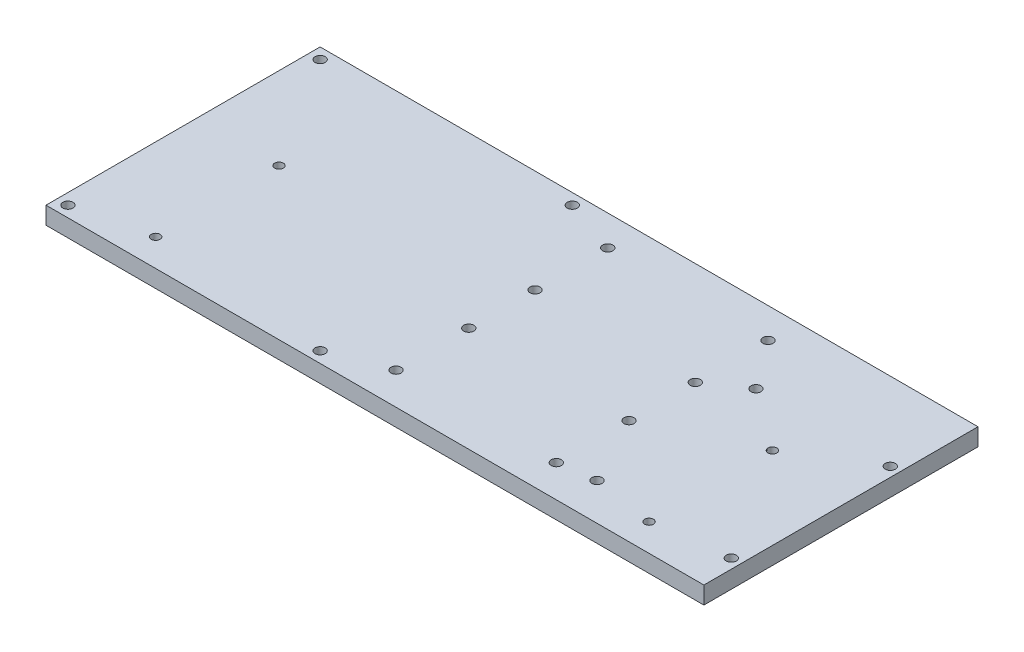
ISO-10303-21;
HEADER;
FILE_DESCRIPTION(('STEP AP214'),'2;1');
FILE_NAME('part.step','',(''),(''),'','','');
FILE_SCHEMA(('AUTOMOTIVE_DESIGN { 1 0 10303 214 1 1 1 1 }'));
ENDSEC;
DATA;
#1=APPLICATION_CONTEXT('core data for automotive mechanical design processes');
#2=APPLICATION_PROTOCOL_DEFINITION('international standard','automotive_design',2000,#1);
#3=PRODUCT_CONTEXT('',#1,'mechanical');
#4=PRODUCT('Part','Part','',(#3));
#5=PRODUCT_RELATED_PRODUCT_CATEGORY('part','',(#4));
#6=PRODUCT_DEFINITION_FORMATION('','',#4);
#7=PRODUCT_DEFINITION_CONTEXT('part definition',#1,'design');
#8=PRODUCT_DEFINITION('design','',#6,#7);
#9=PRODUCT_DEFINITION_SHAPE('','',#8);
#10=(LENGTH_UNIT() NAMED_UNIT(*) SI_UNIT(.MILLI.,.METRE.));
#11=(NAMED_UNIT(*) PLANE_ANGLE_UNIT() SI_UNIT($,.RADIAN.));
#12=(NAMED_UNIT(*) SI_UNIT($,.STERADIAN.) SOLID_ANGLE_UNIT());
#13=UNCERTAINTY_MEASURE_WITH_UNIT(LENGTH_MEASURE(1.E-05),#10,'distance_accuracy_value','');
#14=(GEOMETRIC_REPRESENTATION_CONTEXT(3) GLOBAL_UNCERTAINTY_ASSIGNED_CONTEXT((#13)) GLOBAL_UNIT_ASSIGNED_CONTEXT((#10,
#11,#12)) REPRESENTATION_CONTEXT('',''));
#15=CARTESIAN_POINT('',(0.,0.,0.));
#16=DIRECTION('',(0.,0.,1.));
#17=DIRECTION('',(1.,0.,0.));
#18=AXIS2_PLACEMENT_3D('',#15,#16,#17);
#19=CARTESIAN_POINT('',(120.,6.35,50.));
#20=DIRECTION('',(-1.,0.,0.));
#21=DIRECTION('',(0.,0.,1.));
#22=AXIS2_PLACEMENT_3D('',#19,#20,#21);
#23=PLANE('',#22);
#24=DIRECTION('',(0.,0.,-1.));
#25=VECTOR('',#24,1.);
#26=CARTESIAN_POINT('',(120.,0.,50.));
#27=LINE('',#26,#25);
#28=CARTESIAN_POINT('',(120.,0.,50.));
#29=VERTEX_POINT('',#28);
#30=CARTESIAN_POINT('',(120.,0.,-50.));
#31=VERTEX_POINT('',#30);
#32=EDGE_CURVE('E96',#29,#31,#27,.T.);
#33=ORIENTED_EDGE('',*,*,#32,.T.);
#34=DIRECTION('',(0.,-1.,0.));
#35=VECTOR('',#34,1.);
#36=CARTESIAN_POINT('',(120.,6.35,-50.));
#37=LINE('',#36,#35);
#38=CARTESIAN_POINT('',(120.,6.35,-50.));
#39=VERTEX_POINT('',#38);
#40=EDGE_CURVE('E11',#39,#31,#37,.T.);
#41=ORIENTED_EDGE('',*,*,#40,.F.);
#42=DIRECTION('',(0.,0.,-1.));
#43=VECTOR('',#42,1.);
#44=CARTESIAN_POINT('',(120.,6.35,50.));
#45=LINE('',#44,#43);
#46=CARTESIAN_POINT('',(120.,6.35,50.));
#47=VERTEX_POINT('',#46);
#48=EDGE_CURVE('E84',#47,#39,#45,.T.);
#49=ORIENTED_EDGE('',*,*,#48,.F.);
#50=DIRECTION('',(0.,-1.,0.));
#51=VECTOR('',#50,1.);
#52=CARTESIAN_POINT('',(120.,6.35,50.));
#53=LINE('',#52,#51);
#54=EDGE_CURVE('E92',#47,#29,#53,.T.);
#55=ORIENTED_EDGE('',*,*,#54,.T.);
#56=EDGE_LOOP('',(#33,#41,#49,#55));
#57=FACE_BOUND('',#56,.T.);
#58=ADVANCED_FACE('F33',(#57),#23,.F.);
#59=CARTESIAN_POINT('',(-120.,6.35,-50.));
#60=DIRECTION('',(0.,0.,1.));
#61=DIRECTION('',(1.,0.,0.));
#62=AXIS2_PLACEMENT_3D('',#59,#60,#61);
#63=PLANE('',#62);
#64=DIRECTION('',(-1.,0.,0.));
#65=VECTOR('',#64,1.);
#66=CARTESIAN_POINT('',(-120.,0.,-50.));
#67=LINE('',#66,#65);
#68=CARTESIAN_POINT('',(-120.,0.,-50.));
#69=VERTEX_POINT('',#68);
#70=EDGE_CURVE('E88',#31,#69,#67,.T.);
#71=ORIENTED_EDGE('',*,*,#70,.T.);
#72=DIRECTION('',(0.,-1.,0.));
#73=VECTOR('',#72,1.);
#74=CARTESIAN_POINT('',(-120.,6.35,-50.));
#75=LINE('',#74,#73);
#76=CARTESIAN_POINT('',(-120.,6.35,-50.));
#77=VERTEX_POINT('',#76);
#78=EDGE_CURVE('E41',#77,#69,#75,.T.);
#79=ORIENTED_EDGE('',*,*,#78,.F.);
#80=DIRECTION('',(-1.,0.,0.));
#81=VECTOR('',#80,1.);
#82=CARTESIAN_POINT('',(-120.,6.35,-50.));
#83=LINE('',#82,#81);
#84=EDGE_CURVE('E79',#39,#77,#83,.T.);
#85=ORIENTED_EDGE('',*,*,#84,.F.);
#86=ORIENTED_EDGE('',*,*,#40,.T.);
#87=EDGE_LOOP('',(#71,#79,#85,#86));
#88=FACE_BOUND('',#87,.T.);
#89=ADVANCED_FACE('F87',(#88),#63,.F.);
#90=CARTESIAN_POINT('',(-120.,6.35,50.));
#91=DIRECTION('',(1.,0.,0.));
#92=DIRECTION('',(0.,0.,-1.));
#93=AXIS2_PLACEMENT_3D('',#90,#91,#92);
#94=PLANE('',#93);
#95=DIRECTION('',(0.,0.,1.));
#96=VECTOR('',#95,1.);
#97=CARTESIAN_POINT('',(-120.,0.,50.));
#98=LINE('',#97,#96);
#99=CARTESIAN_POINT('',(-120.,0.,50.));
#100=VERTEX_POINT('',#99);
#101=EDGE_CURVE('E66',#69,#100,#98,.T.);
#102=ORIENTED_EDGE('',*,*,#101,.T.);
#103=DIRECTION('',(0.,-1.,0.));
#104=VECTOR('',#103,1.);
#105=CARTESIAN_POINT('',(-120.,6.35,50.));
#106=LINE('',#105,#104);
#107=CARTESIAN_POINT('',(-120.,6.35,50.));
#108=VERTEX_POINT('',#107);
#109=EDGE_CURVE('E89',#108,#100,#106,.T.);
#110=ORIENTED_EDGE('',*,*,#109,.F.);
#111=DIRECTION('',(0.,0.,1.));
#112=VECTOR('',#111,1.);
#113=CARTESIAN_POINT('',(-120.,6.35,50.));
#114=LINE('',#113,#112);
#115=EDGE_CURVE('E82',#77,#108,#114,.T.);
#116=ORIENTED_EDGE('',*,*,#115,.F.);
#117=ORIENTED_EDGE('',*,*,#78,.T.);
#118=EDGE_LOOP('',(#102,#110,#116,#117));
#119=FACE_BOUND('',#118,.T.);
#120=ADVANCED_FACE('F90',(#119),#94,.F.);
#121=CARTESIAN_POINT('',(-120.,6.35,50.));
#122=DIRECTION('',(0.,0.,-1.));
#123=DIRECTION('',(-1.,0.,0.));
#124=AXIS2_PLACEMENT_3D('',#121,#122,#123);
#125=PLANE('',#124);
#126=DIRECTION('',(1.,0.,0.));
#127=VECTOR('',#126,1.);
#128=CARTESIAN_POINT('',(-120.,0.,50.));
#129=LINE('',#128,#127);
#130=EDGE_CURVE('E72',#100,#29,#129,.T.);
#131=ORIENTED_EDGE('',*,*,#130,.T.);
#132=ORIENTED_EDGE('',*,*,#54,.F.);
#133=DIRECTION('',(1.,0.,0.));
#134=VECTOR('',#133,1.);
#135=CARTESIAN_POINT('',(-120.,6.35,50.));
#136=LINE('',#135,#134);
#137=EDGE_CURVE('E49',#108,#47,#136,.T.);
#138=ORIENTED_EDGE('',*,*,#137,.F.);
#139=ORIENTED_EDGE('',*,*,#109,.T.);
#140=EDGE_LOOP('',(#131,#132,#138,#139));
#141=FACE_BOUND('',#140,.T.);
#142=ADVANCED_FACE('F104',(#141),#125,.F.);
#143=CARTESIAN_POINT('',(0.,6.35,0.));
#144=DIRECTION('',(0.,-1.,0.));
#145=DIRECTION('',(0.,0.,-1.));
#146=AXIS2_PLACEMENT_3D('',#143,#144,#145);
#147=PLANE('',#146);
#148=CARTESIAN_POINT('',(-90.,6.35,40.));
#149=DIRECTION('',(0.,1.,0.));
#150=DIRECTION('',(0.,0.,1.));
#151=AXIS2_PLACEMENT_3D('',#148,#149,#150);
#152=CIRCLE('',#151,1.60000000000001);
#153=CARTESIAN_POINT('',(-90.,6.35,41.6));
#154=VERTEX_POINT('',#153);
#155=EDGE_CURVE('E224',#154,#154,#152,.T.);
#156=ORIENTED_EDGE('',*,*,#155,.F.);
#157=EDGE_LOOP('',(#156));
#158=FACE_BOUND('',#157,.T.);
#159=CARTESIAN_POINT('',(90.,6.35,-5.));
#160=DIRECTION('',(0.,1.,0.));
#161=DIRECTION('',(0.,0.,1.));
#162=AXIS2_PLACEMENT_3D('',#159,#160,#161);
#163=CIRCLE('',#162,1.60000000000001);
#164=CARTESIAN_POINT('',(90.,6.35,-3.39999999999999));
#165=VERTEX_POINT('',#164);
#166=EDGE_CURVE('E218',#165,#165,#163,.T.);
#167=ORIENTED_EDGE('',*,*,#166,.F.);
#168=EDGE_LOOP('',(#167));
#169=FACE_BOUND('',#168,.T.);
#170=CARTESIAN_POINT('',(90.,6.35,40.));
#171=DIRECTION('',(0.,1.,0.));
#172=DIRECTION('',(0.,0.,1.));
#173=AXIS2_PLACEMENT_3D('',#170,#171,#172);
#174=CIRCLE('',#173,1.60000000000001);
#175=CARTESIAN_POINT('',(90.,6.35,41.6));
#176=VERTEX_POINT('',#175);
#177=EDGE_CURVE('E212',#176,#176,#174,.T.);
#178=ORIENTED_EDGE('',*,*,#177,.F.);
#179=EDGE_LOOP('',(#178));
#180=FACE_BOUND('',#179,.T.);
#181=CARTESIAN_POINT('',(-90.,6.35,-5.));
#182=DIRECTION('',(0.,1.,0.));
#183=DIRECTION('',(0.,0.,1.));
#184=AXIS2_PLACEMENT_3D('',#181,#182,#183);
#185=CIRCLE('',#184,1.60000000000001);
#186=CARTESIAN_POINT('',(-90.,6.35,-3.39999999999999));
#187=VERTEX_POINT('',#186);
#188=EDGE_CURVE('E206',#187,#187,#185,.T.);
#189=ORIENTED_EDGE('',*,*,#188,.F.);
#190=EDGE_LOOP('',(#189));
#191=FACE_BOUND('',#190,.T.);
#192=CARTESIAN_POINT('',(-4.025,6.35,-12.4399999999999));
#193=DIRECTION('',(0.,-1.,0.));
#194=DIRECTION('',(0.,0.,-1.));
#195=AXIS2_PLACEMENT_3D('',#192,#193,#194);
#196=CIRCLE('',#195,1.85);
#197=CARTESIAN_POINT('',(-4.025,6.35,-14.2899999999999));
#198=VERTEX_POINT('',#197);
#199=EDGE_CURVE('E199',#198,#198,#196,.T.);
#200=ORIENTED_EDGE('',*,*,#199,.T.);
#201=EDGE_LOOP('',(#200));
#202=FACE_BOUND('',#201,.T.);
#203=CARTESIAN_POINT('',(-24.,6.35,-45.9999999999999));
#204=DIRECTION('',(0.,-1.,0.));
#205=DIRECTION('',(0.,0.,-1.));
#206=AXIS2_PLACEMENT_3D('',#203,#204,#205);
#207=CIRCLE('',#206,1.85);
#208=CARTESIAN_POINT('',(-24.,6.35,-47.8499999999999));
#209=VERTEX_POINT('',#208);
#210=EDGE_CURVE('E193',#209,#209,#207,.T.);
#211=ORIENTED_EDGE('',*,*,#210,.T.);
#212=EDGE_LOOP('',(#211));
#213=FACE_BOUND('',#212,.T.);
#214=CARTESIAN_POINT('',(-4.02499999999999,6.35,-38.9599999999999));
#215=DIRECTION('',(0.,-1.,0.));
#216=DIRECTION('',(0.,0.,-1.));
#217=AXIS2_PLACEMENT_3D('',#214,#215,#216);
#218=CIRCLE('',#217,1.85);
#219=CARTESIAN_POINT('',(-4.02499999999999,6.35,-40.8099999999999));
#220=VERTEX_POINT('',#219);
#221=EDGE_CURVE('E187',#220,#220,#218,.T.);
#222=ORIENTED_EDGE('',*,*,#221,.T.);
#223=EDGE_LOOP('',(#222));
#224=FACE_BOUND('',#223,.T.);
#225=CARTESIAN_POINT('',(-4.02500000000004,6.35,11.7400000000001));
#226=DIRECTION('',(0.,-1.,0.));
#227=DIRECTION('',(0.,0.,-1.));
#228=AXIS2_PLACEMENT_3D('',#225,#226,#227);
#229=CIRCLE('',#228,1.85);
#230=CARTESIAN_POINT('',(-4.02500000000004,6.35,9.89000000000007));
#231=VERTEX_POINT('',#230);
#232=EDGE_CURVE('E181',#231,#231,#229,.T.);
#233=ORIENTED_EDGE('',*,*,#232,.T.);
#234=EDGE_LOOP('',(#233));
#235=FACE_BOUND('',#234,.T.);
#236=CARTESIAN_POINT('',(-4.02500000000004,6.35,38.2600000000001));
#237=DIRECTION('',(0.,-1.,0.));
#238=DIRECTION('',(0.,0.,-1.));
#239=AXIS2_PLACEMENT_3D('',#236,#237,#238);
#240=CIRCLE('',#239,1.85);
#241=CARTESIAN_POINT('',(-4.02500000000004,6.35,36.4100000000001));
#242=VERTEX_POINT('',#241);
#243=EDGE_CURVE('E175',#242,#242,#240,.T.);
#244=ORIENTED_EDGE('',*,*,#243,.T.);
#245=EDGE_LOOP('',(#244));
#246=FACE_BOUND('',#245,.T.);
#247=CARTESIAN_POINT('',(-24.0000000000001,6.35,46.0000000000001));
#248=DIRECTION('',(0.,-1.,0.));
#249=DIRECTION('',(0.,0.,-1.));
#250=AXIS2_PLACEMENT_3D('',#247,#248,#249);
#251=CIRCLE('',#250,1.85);
#252=CARTESIAN_POINT('',(-24.0000000000001,6.35,44.1500000000001));
#253=VERTEX_POINT('',#252);
#254=EDGE_CURVE('E169',#253,#253,#251,.T.);
#255=ORIENTED_EDGE('',*,*,#254,.T.);
#256=EDGE_LOOP('',(#255));
#257=FACE_BOUND('',#256,.T.);
#258=CARTESIAN_POINT('',(-116.,6.35,46.));
#259=DIRECTION('',(0.,-1.,0.));
#260=DIRECTION('',(0.,0.,-1.));
#261=AXIS2_PLACEMENT_3D('',#258,#259,#260);
#262=CIRCLE('',#261,1.85);
#263=CARTESIAN_POINT('',(-116.,6.35,44.15));
#264=VERTEX_POINT('',#263);
#265=EDGE_CURVE('E163',#264,#264,#262,.T.);
#266=ORIENTED_EDGE('',*,*,#265,.T.);
#267=EDGE_LOOP('',(#266));
#268=FACE_BOUND('',#267,.T.);
#269=CARTESIAN_POINT('',(54.425,6.35,38.2600000000001));
#270=DIRECTION('',(0.,-1.,0.));
#271=DIRECTION('',(0.,0.,-1.));
#272=AXIS2_PLACEMENT_3D('',#269,#270,#271);
#273=CIRCLE('',#272,1.85);
#274=CARTESIAN_POINT('',(54.425,6.35,36.4100000000001));
#275=VERTEX_POINT('',#274);
#276=EDGE_CURVE('E157',#275,#275,#273,.T.);
#277=ORIENTED_EDGE('',*,*,#276,.T.);
#278=EDGE_LOOP('',(#277));
#279=FACE_BOUND('',#278,.T.);
#280=CARTESIAN_POINT('',(54.425,6.35,11.7400000000001));
#281=DIRECTION('',(0.,-1.,0.));
#282=DIRECTION('',(0.,0.,-1.));
#283=AXIS2_PLACEMENT_3D('',#280,#281,#282);
#284=CIRCLE('',#283,1.85);
#285=CARTESIAN_POINT('',(54.425,6.35,9.89000000000009));
#286=VERTEX_POINT('',#285);
#287=EDGE_CURVE('E151',#286,#286,#284,.T.);
#288=ORIENTED_EDGE('',*,*,#287,.T.);
#289=EDGE_LOOP('',(#288));
#290=FACE_BOUND('',#289,.T.);
#291=CARTESIAN_POINT('',(54.425,6.35,-12.4399999999999));
#292=DIRECTION('',(0.,-1.,0.));
#293=DIRECTION('',(0.,0.,-1.));
#294=AXIS2_PLACEMENT_3D('',#291,#292,#293);
#295=CIRCLE('',#294,1.85);
#296=CARTESIAN_POINT('',(54.425,6.35,-14.2899999999999));
#297=VERTEX_POINT('',#296);
#298=EDGE_CURVE('E145',#297,#297,#295,.T.);
#299=ORIENTED_EDGE('',*,*,#298,.T.);
#300=EDGE_LOOP('',(#299));
#301=FACE_BOUND('',#300,.T.);
#302=CARTESIAN_POINT('',(54.425,6.35,-38.9599999999999));
#303=DIRECTION('',(0.,-1.,0.));
#304=DIRECTION('',(0.,0.,-1.));
#305=AXIS2_PLACEMENT_3D('',#302,#303,#304);
#306=CIRCLE('',#305,1.85);
#307=CARTESIAN_POINT('',(54.425,6.35,-40.8099999999999));
#308=VERTEX_POINT('',#307);
#309=EDGE_CURVE('E139',#308,#308,#306,.T.);
#310=ORIENTED_EDGE('',*,*,#309,.T.);
#311=EDGE_LOOP('',(#310));
#312=FACE_BOUND('',#311,.T.);
#313=CARTESIAN_POINT('',(116.5,6.35,36.5));
#314=DIRECTION('',(0.,-1.,0.));
#315=DIRECTION('',(0.,0.,-1.));
#316=AXIS2_PLACEMENT_3D('',#313,#314,#315);
#317=CIRCLE('',#316,1.85);
#318=CARTESIAN_POINT('',(116.5,6.35,34.65));
#319=VERTEX_POINT('',#318);
#320=EDGE_CURVE('E133',#319,#319,#317,.T.);
#321=ORIENTED_EDGE('',*,*,#320,.T.);
#322=EDGE_LOOP('',(#321));
#323=FACE_BOUND('',#322,.T.);
#324=CARTESIAN_POINT('',(116.5,6.35,-21.5));
#325=DIRECTION('',(0.,-1.,0.));
#326=DIRECTION('',(0.,0.,-1.));
#327=AXIS2_PLACEMENT_3D('',#324,#325,#326);
#328=CIRCLE('',#327,1.85);
#329=CARTESIAN_POINT('',(116.5,6.35,-23.35));
#330=VERTEX_POINT('',#329);
#331=EDGE_CURVE('E127',#330,#330,#328,.T.);
#332=ORIENTED_EDGE('',*,*,#331,.T.);
#333=EDGE_LOOP('',(#332));
#334=FACE_BOUND('',#333,.T.);
#335=CARTESIAN_POINT('',(67.5,6.35,-21.5));
#336=DIRECTION('',(0.,-1.,0.));
#337=DIRECTION('',(0.,0.,-1.));
#338=AXIS2_PLACEMENT_3D('',#335,#336,#337);
#339=CIRCLE('',#338,1.85);
#340=CARTESIAN_POINT('',(67.5,6.35,-23.35));
#341=VERTEX_POINT('',#340);
#342=EDGE_CURVE('E121',#341,#341,#339,.T.);
#343=ORIENTED_EDGE('',*,*,#342,.T.);
#344=EDGE_LOOP('',(#343));
#345=FACE_BOUND('',#344,.T.);
#346=CARTESIAN_POINT('',(67.5,6.35,36.5));
#347=DIRECTION('',(0.,-1.,0.));
#348=DIRECTION('',(0.,0.,-1.));
#349=AXIS2_PLACEMENT_3D('',#346,#347,#348);
#350=CIRCLE('',#349,1.85);
#351=CARTESIAN_POINT('',(67.5,6.35,34.65));
#352=VERTEX_POINT('',#351);
#353=EDGE_CURVE('E115',#352,#352,#350,.T.);
#354=ORIENTED_EDGE('',*,*,#353,.T.);
#355=EDGE_LOOP('',(#354));
#356=FACE_BOUND('',#355,.T.);
#357=CARTESIAN_POINT('',(-116.,6.35,-46.));
#358=DIRECTION('',(0.,-1.,0.));
#359=DIRECTION('',(0.,0.,-1.));
#360=AXIS2_PLACEMENT_3D('',#357,#358,#359);
#361=CIRCLE('',#360,1.85);
#362=CARTESIAN_POINT('',(-116.,6.35,-47.85));
#363=VERTEX_POINT('',#362);
#364=EDGE_CURVE('E99',#363,#363,#361,.T.);
#365=ORIENTED_EDGE('',*,*,#364,.T.);
#366=EDGE_LOOP('',(#365));
#367=FACE_BOUND('',#366,.T.);
#368=ORIENTED_EDGE('',*,*,#48,.T.);
#369=ORIENTED_EDGE('',*,*,#84,.T.);
#370=ORIENTED_EDGE('',*,*,#115,.T.);
#371=ORIENTED_EDGE('',*,*,#137,.T.);
#372=EDGE_LOOP('',(#368,#369,#370,#371));
#373=FACE_BOUND('',#372,.T.);
#374=ADVANCED_FACE('F80',(#158,#169,#180,#191,#202,#213,#224,#235,#246,#257,#268,#279,#290,#301,
#312,#323,#334,#345,#356,#367,#373),#147,.F.);
#375=CARTESIAN_POINT('',(0.,0.,0.));
#376=DIRECTION('',(0.,-1.,0.));
#377=DIRECTION('',(0.,0.,-1.));
#378=AXIS2_PLACEMENT_3D('',#375,#376,#377);
#379=PLANE('',#378);
#380=CARTESIAN_POINT('',(-90.,0.,40.));
#381=DIRECTION('',(0.,1.,0.));
#382=DIRECTION('',(0.,0.,1.));
#383=AXIS2_PLACEMENT_3D('',#380,#381,#382);
#384=CIRCLE('',#383,1.60000000000001);
#385=CARTESIAN_POINT('',(-90.,0.,41.6));
#386=VERTEX_POINT('',#385);
#387=EDGE_CURVE('E209',#386,#386,#384,.T.);
#388=ORIENTED_EDGE('',*,*,#387,.T.);
#389=EDGE_LOOP('',(#388));
#390=FACE_BOUND('',#389,.T.);
#391=CARTESIAN_POINT('',(90.,0.,-5.));
#392=DIRECTION('',(0.,1.,0.));
#393=DIRECTION('',(0.,0.,1.));
#394=AXIS2_PLACEMENT_3D('',#391,#392,#393);
#395=CIRCLE('',#394,1.60000000000001);
#396=CARTESIAN_POINT('',(90.,0.,-3.39999999999999));
#397=VERTEX_POINT('',#396);
#398=EDGE_CURVE('E221',#397,#397,#395,.T.);
#399=ORIENTED_EDGE('',*,*,#398,.T.);
#400=EDGE_LOOP('',(#399));
#401=FACE_BOUND('',#400,.T.);
#402=CARTESIAN_POINT('',(90.,0.,40.));
#403=DIRECTION('',(0.,1.,0.));
#404=DIRECTION('',(0.,0.,1.));
#405=AXIS2_PLACEMENT_3D('',#402,#403,#404);
#406=CIRCLE('',#405,1.60000000000001);
#407=CARTESIAN_POINT('',(90.,0.,41.6));
#408=VERTEX_POINT('',#407);
#409=EDGE_CURVE('E215',#408,#408,#406,.T.);
#410=ORIENTED_EDGE('',*,*,#409,.T.);
#411=EDGE_LOOP('',(#410));
#412=FACE_BOUND('',#411,.T.);
#413=CARTESIAN_POINT('',(-90.,0.,-5.));
#414=DIRECTION('',(0.,1.,0.));
#415=DIRECTION('',(0.,0.,1.));
#416=AXIS2_PLACEMENT_3D('',#413,#414,#415);
#417=CIRCLE('',#416,1.60000000000001);
#418=CARTESIAN_POINT('',(-90.,0.,-3.39999999999999));
#419=VERTEX_POINT('',#418);
#420=EDGE_CURVE('E205',#419,#419,#417,.T.);
#421=ORIENTED_EDGE('',*,*,#420,.T.);
#422=EDGE_LOOP('',(#421));
#423=FACE_BOUND('',#422,.T.);
#424=CARTESIAN_POINT('',(-4.025,0.,-12.4399999999999));
#425=DIRECTION('',(0.,-1.,0.));
#426=DIRECTION('',(0.,0.,-1.));
#427=AXIS2_PLACEMENT_3D('',#424,#425,#426);
#428=CIRCLE('',#427,1.84999999999999);
#429=CARTESIAN_POINT('',(-4.025,0.,-14.2899999999999));
#430=VERTEX_POINT('',#429);
#431=EDGE_CURVE('E202',#430,#430,#428,.T.);
#432=ORIENTED_EDGE('',*,*,#431,.F.);
#433=EDGE_LOOP('',(#432));
#434=FACE_BOUND('',#433,.T.);
#435=CARTESIAN_POINT('',(-24.,0.,-45.9999999999999));
#436=DIRECTION('',(0.,-1.,0.));
#437=DIRECTION('',(0.,0.,-1.));
#438=AXIS2_PLACEMENT_3D('',#435,#436,#437);
#439=CIRCLE('',#438,1.84999999999999);
#440=CARTESIAN_POINT('',(-24.,0.,-47.8499999999999));
#441=VERTEX_POINT('',#440);
#442=EDGE_CURVE('E196',#441,#441,#439,.T.);
#443=ORIENTED_EDGE('',*,*,#442,.F.);
#444=EDGE_LOOP('',(#443));
#445=FACE_BOUND('',#444,.T.);
#446=CARTESIAN_POINT('',(-4.02499999999999,0.,-38.9599999999999));
#447=DIRECTION('',(0.,-1.,0.));
#448=DIRECTION('',(0.,0.,-1.));
#449=AXIS2_PLACEMENT_3D('',#446,#447,#448);
#450=CIRCLE('',#449,1.84999999999999);
#451=CARTESIAN_POINT('',(-4.02499999999999,0.,-40.8099999999999));
#452=VERTEX_POINT('',#451);
#453=EDGE_CURVE('E190',#452,#452,#450,.T.);
#454=ORIENTED_EDGE('',*,*,#453,.F.);
#455=EDGE_LOOP('',(#454));
#456=FACE_BOUND('',#455,.T.);
#457=CARTESIAN_POINT('',(-4.02500000000004,0.,11.7400000000001));
#458=DIRECTION('',(0.,-1.,0.));
#459=DIRECTION('',(0.,0.,-1.));
#460=AXIS2_PLACEMENT_3D('',#457,#458,#459);
#461=CIRCLE('',#460,1.84999999999999);
#462=CARTESIAN_POINT('',(-4.02500000000004,0.,9.89000000000008));
#463=VERTEX_POINT('',#462);
#464=EDGE_CURVE('E184',#463,#463,#461,.T.);
#465=ORIENTED_EDGE('',*,*,#464,.F.);
#466=EDGE_LOOP('',(#465));
#467=FACE_BOUND('',#466,.T.);
#468=CARTESIAN_POINT('',(-4.02500000000004,0.,38.2600000000001));
#469=DIRECTION('',(0.,-1.,0.));
#470=DIRECTION('',(0.,0.,-1.));
#471=AXIS2_PLACEMENT_3D('',#468,#469,#470);
#472=CIRCLE('',#471,1.84999999999999);
#473=CARTESIAN_POINT('',(-4.02500000000004,0.,36.4100000000001));
#474=VERTEX_POINT('',#473);
#475=EDGE_CURVE('E178',#474,#474,#472,.T.);
#476=ORIENTED_EDGE('',*,*,#475,.F.);
#477=EDGE_LOOP('',(#476));
#478=FACE_BOUND('',#477,.T.);
#479=CARTESIAN_POINT('',(-24.0000000000001,0.,46.0000000000001));
#480=DIRECTION('',(0.,-1.,0.));
#481=DIRECTION('',(0.,0.,-1.));
#482=AXIS2_PLACEMENT_3D('',#479,#480,#481);
#483=CIRCLE('',#482,1.84999999999999);
#484=CARTESIAN_POINT('',(-24.0000000000001,0.,44.1500000000001));
#485=VERTEX_POINT('',#484);
#486=EDGE_CURVE('E172',#485,#485,#483,.T.);
#487=ORIENTED_EDGE('',*,*,#486,.F.);
#488=EDGE_LOOP('',(#487));
#489=FACE_BOUND('',#488,.T.);
#490=CARTESIAN_POINT('',(-116.,0.,46.));
#491=DIRECTION('',(0.,-1.,0.));
#492=DIRECTION('',(0.,0.,-1.));
#493=AXIS2_PLACEMENT_3D('',#490,#491,#492);
#494=CIRCLE('',#493,1.84999999999999);
#495=CARTESIAN_POINT('',(-116.,0.,44.15));
#496=VERTEX_POINT('',#495);
#497=EDGE_CURVE('E166',#496,#496,#494,.T.);
#498=ORIENTED_EDGE('',*,*,#497,.F.);
#499=EDGE_LOOP('',(#498));
#500=FACE_BOUND('',#499,.T.);
#501=CARTESIAN_POINT('',(54.425,0.,38.2600000000001));
#502=DIRECTION('',(0.,-1.,0.));
#503=DIRECTION('',(0.,0.,-1.));
#504=AXIS2_PLACEMENT_3D('',#501,#502,#503);
#505=CIRCLE('',#504,1.85);
#506=CARTESIAN_POINT('',(54.425,0.,36.4100000000001));
#507=VERTEX_POINT('',#506);
#508=EDGE_CURVE('E160',#507,#507,#505,.T.);
#509=ORIENTED_EDGE('',*,*,#508,.F.);
#510=EDGE_LOOP('',(#509));
#511=FACE_BOUND('',#510,.T.);
#512=CARTESIAN_POINT('',(54.425,0.,11.7400000000001));
#513=DIRECTION('',(0.,-1.,0.));
#514=DIRECTION('',(0.,0.,-1.));
#515=AXIS2_PLACEMENT_3D('',#512,#513,#514);
#516=CIRCLE('',#515,1.85);
#517=CARTESIAN_POINT('',(54.425,0.,9.89000000000009));
#518=VERTEX_POINT('',#517);
#519=EDGE_CURVE('E154',#518,#518,#516,.T.);
#520=ORIENTED_EDGE('',*,*,#519,.F.);
#521=EDGE_LOOP('',(#520));
#522=FACE_BOUND('',#521,.T.);
#523=CARTESIAN_POINT('',(54.425,0.,-12.4399999999999));
#524=DIRECTION('',(0.,-1.,0.));
#525=DIRECTION('',(0.,0.,-1.));
#526=AXIS2_PLACEMENT_3D('',#523,#524,#525);
#527=CIRCLE('',#526,1.85);
#528=CARTESIAN_POINT('',(54.425,0.,-14.2899999999999));
#529=VERTEX_POINT('',#528);
#530=EDGE_CURVE('E148',#529,#529,#527,.T.);
#531=ORIENTED_EDGE('',*,*,#530,.F.);
#532=EDGE_LOOP('',(#531));
#533=FACE_BOUND('',#532,.T.);
#534=CARTESIAN_POINT('',(54.425,0.,-38.9599999999999));
#535=DIRECTION('',(0.,-1.,0.));
#536=DIRECTION('',(0.,0.,-1.));
#537=AXIS2_PLACEMENT_3D('',#534,#535,#536);
#538=CIRCLE('',#537,1.85);
#539=CARTESIAN_POINT('',(54.425,0.,-40.8099999999999));
#540=VERTEX_POINT('',#539);
#541=EDGE_CURVE('E142',#540,#540,#538,.T.);
#542=ORIENTED_EDGE('',*,*,#541,.F.);
#543=EDGE_LOOP('',(#542));
#544=FACE_BOUND('',#543,.T.);
#545=CARTESIAN_POINT('',(116.5,0.,36.5));
#546=DIRECTION('',(0.,-1.,0.));
#547=DIRECTION('',(0.,0.,-1.));
#548=AXIS2_PLACEMENT_3D('',#545,#546,#547);
#549=CIRCLE('',#548,1.84999999999999);
#550=CARTESIAN_POINT('',(116.5,0.,34.65));
#551=VERTEX_POINT('',#550);
#552=EDGE_CURVE('E136',#551,#551,#549,.T.);
#553=ORIENTED_EDGE('',*,*,#552,.F.);
#554=EDGE_LOOP('',(#553));
#555=FACE_BOUND('',#554,.T.);
#556=CARTESIAN_POINT('',(116.5,0.,-21.5));
#557=DIRECTION('',(0.,-1.,0.));
#558=DIRECTION('',(0.,0.,-1.));
#559=AXIS2_PLACEMENT_3D('',#556,#557,#558);
#560=CIRCLE('',#559,1.84999999999999);
#561=CARTESIAN_POINT('',(116.5,0.,-23.35));
#562=VERTEX_POINT('',#561);
#563=EDGE_CURVE('E130',#562,#562,#560,.T.);
#564=ORIENTED_EDGE('',*,*,#563,.F.);
#565=EDGE_LOOP('',(#564));
#566=FACE_BOUND('',#565,.T.);
#567=CARTESIAN_POINT('',(67.5,0.,-21.5));
#568=DIRECTION('',(0.,-1.,0.));
#569=DIRECTION('',(0.,0.,-1.));
#570=AXIS2_PLACEMENT_3D('',#567,#568,#569);
#571=CIRCLE('',#570,1.84999999999999);
#572=CARTESIAN_POINT('',(67.5,0.,-23.35));
#573=VERTEX_POINT('',#572);
#574=EDGE_CURVE('E124',#573,#573,#571,.T.);
#575=ORIENTED_EDGE('',*,*,#574,.F.);
#576=EDGE_LOOP('',(#575));
#577=FACE_BOUND('',#576,.T.);
#578=CARTESIAN_POINT('',(67.5,0.,36.5));
#579=DIRECTION('',(0.,-1.,0.));
#580=DIRECTION('',(0.,0.,-1.));
#581=AXIS2_PLACEMENT_3D('',#578,#579,#580);
#582=CIRCLE('',#581,1.84999999999999);
#583=CARTESIAN_POINT('',(67.5,0.,34.65));
#584=VERTEX_POINT('',#583);
#585=EDGE_CURVE('E118',#584,#584,#582,.T.);
#586=ORIENTED_EDGE('',*,*,#585,.F.);
#587=EDGE_LOOP('',(#586));
#588=FACE_BOUND('',#587,.T.);
#589=CARTESIAN_POINT('',(-116.,0.,-46.));
#590=DIRECTION('',(0.,-1.,0.));
#591=DIRECTION('',(0.,0.,-1.));
#592=AXIS2_PLACEMENT_3D('',#589,#590,#591);
#593=CIRCLE('',#592,1.84999999999999);
#594=CARTESIAN_POINT('',(-116.,0.,-47.85));
#595=VERTEX_POINT('',#594);
#596=EDGE_CURVE('E112',#595,#595,#593,.T.);
#597=ORIENTED_EDGE('',*,*,#596,.F.);
#598=EDGE_LOOP('',(#597));
#599=FACE_BOUND('',#598,.T.);
#600=ORIENTED_EDGE('',*,*,#32,.F.);
#601=ORIENTED_EDGE('',*,*,#130,.F.);
#602=ORIENTED_EDGE('',*,*,#101,.F.);
#603=ORIENTED_EDGE('',*,*,#70,.F.);
#604=EDGE_LOOP('',(#600,#601,#602,#603));
#605=FACE_BOUND('',#604,.T.);
#606=ADVANCED_FACE('F107',(#390,#401,#412,#423,#434,#445,#456,#467,#478,#489,#500,#511,#522,
#533,#544,#555,#566,#577,#588,#599,#605),#379,.T.);
#607=CARTESIAN_POINT('',(-116.,0.,-46.));
#608=DIRECTION('',(0.,-1.,0.));
#609=DIRECTION('',(0.,0.,-1.));
#610=AXIS2_PLACEMENT_3D('',#607,#608,#609);
#611=CYLINDRICAL_SURFACE('',#610,1.85);
#612=ORIENTED_EDGE('',*,*,#364,.F.);
#613=EDGE_LOOP('',(#612));
#614=FACE_BOUND('',#613,.T.);
#615=ORIENTED_EDGE('',*,*,#596,.T.);
#616=EDGE_LOOP('',(#615));
#617=FACE_BOUND('',#616,.T.);
#618=ADVANCED_FACE('F280',(#614,#617),#611,.F.);
#619=CARTESIAN_POINT('',(67.5,0.,36.5));
#620=DIRECTION('',(0.,-1.,0.));
#621=DIRECTION('',(0.,0.,-1.));
#622=AXIS2_PLACEMENT_3D('',#619,#620,#621);
#623=CYLINDRICAL_SURFACE('',#622,1.85);
#624=ORIENTED_EDGE('',*,*,#353,.F.);
#625=EDGE_LOOP('',(#624));
#626=FACE_BOUND('',#625,.T.);
#627=ORIENTED_EDGE('',*,*,#585,.T.);
#628=EDGE_LOOP('',(#627));
#629=FACE_BOUND('',#628,.T.);
#630=ADVANCED_FACE('F283',(#626,#629),#623,.F.);
#631=CARTESIAN_POINT('',(67.5,0.,-21.5));
#632=DIRECTION('',(0.,-1.,0.));
#633=DIRECTION('',(0.,0.,-1.));
#634=AXIS2_PLACEMENT_3D('',#631,#632,#633);
#635=CYLINDRICAL_SURFACE('',#634,1.85);
#636=ORIENTED_EDGE('',*,*,#342,.F.);
#637=EDGE_LOOP('',(#636));
#638=FACE_BOUND('',#637,.T.);
#639=ORIENTED_EDGE('',*,*,#574,.T.);
#640=EDGE_LOOP('',(#639));
#641=FACE_BOUND('',#640,.T.);
#642=ADVANCED_FACE('F412',(#638,#641),#635,.F.);
#643=CARTESIAN_POINT('',(116.5,0.,-21.5));
#644=DIRECTION('',(0.,-1.,0.));
#645=DIRECTION('',(0.,0.,-1.));
#646=AXIS2_PLACEMENT_3D('',#643,#644,#645);
#647=CYLINDRICAL_SURFACE('',#646,1.85);
#648=ORIENTED_EDGE('',*,*,#331,.F.);
#649=EDGE_LOOP('',(#648));
#650=FACE_BOUND('',#649,.T.);
#651=ORIENTED_EDGE('',*,*,#563,.T.);
#652=EDGE_LOOP('',(#651));
#653=FACE_BOUND('',#652,.T.);
#654=ADVANCED_FACE('F408',(#650,#653),#647,.F.);
#655=CARTESIAN_POINT('',(116.5,0.,36.5));
#656=DIRECTION('',(0.,-1.,0.));
#657=DIRECTION('',(0.,0.,-1.));
#658=AXIS2_PLACEMENT_3D('',#655,#656,#657);
#659=CYLINDRICAL_SURFACE('',#658,1.85);
#660=ORIENTED_EDGE('',*,*,#320,.F.);
#661=EDGE_LOOP('',(#660));
#662=FACE_BOUND('',#661,.T.);
#663=ORIENTED_EDGE('',*,*,#552,.T.);
#664=EDGE_LOOP('',(#663));
#665=FACE_BOUND('',#664,.T.);
#666=ADVANCED_FACE('F404',(#662,#665),#659,.F.);
#667=CARTESIAN_POINT('',(54.425,0.,-38.9599999999999));
#668=DIRECTION('',(0.,-1.,0.));
#669=DIRECTION('',(0.,0.,-1.));
#670=AXIS2_PLACEMENT_3D('',#667,#668,#669);
#671=CYLINDRICAL_SURFACE('',#670,1.85);
#672=ORIENTED_EDGE('',*,*,#309,.F.);
#673=EDGE_LOOP('',(#672));
#674=FACE_BOUND('',#673,.T.);
#675=ORIENTED_EDGE('',*,*,#541,.T.);
#676=EDGE_LOOP('',(#675));
#677=FACE_BOUND('',#676,.T.);
#678=ADVANCED_FACE('F400',(#674,#677),#671,.F.);
#679=CARTESIAN_POINT('',(54.425,0.,-12.4399999999999));
#680=DIRECTION('',(0.,-1.,0.));
#681=DIRECTION('',(0.,0.,-1.));
#682=AXIS2_PLACEMENT_3D('',#679,#680,#681);
#683=CYLINDRICAL_SURFACE('',#682,1.85);
#684=ORIENTED_EDGE('',*,*,#298,.F.);
#685=EDGE_LOOP('',(#684));
#686=FACE_BOUND('',#685,.T.);
#687=ORIENTED_EDGE('',*,*,#530,.T.);
#688=EDGE_LOOP('',(#687));
#689=FACE_BOUND('',#688,.T.);
#690=ADVANCED_FACE('F396',(#686,#689),#683,.F.);
#691=CARTESIAN_POINT('',(54.425,0.,11.7400000000001));
#692=DIRECTION('',(0.,-1.,0.));
#693=DIRECTION('',(0.,0.,-1.));
#694=AXIS2_PLACEMENT_3D('',#691,#692,#693);
#695=CYLINDRICAL_SURFACE('',#694,1.85);
#696=ORIENTED_EDGE('',*,*,#287,.F.);
#697=EDGE_LOOP('',(#696));
#698=FACE_BOUND('',#697,.T.);
#699=ORIENTED_EDGE('',*,*,#519,.T.);
#700=EDGE_LOOP('',(#699));
#701=FACE_BOUND('',#700,.T.);
#702=ADVANCED_FACE('F392',(#698,#701),#695,.F.);
#703=CARTESIAN_POINT('',(54.425,0.,38.2600000000001));
#704=DIRECTION('',(0.,-1.,0.));
#705=DIRECTION('',(0.,0.,-1.));
#706=AXIS2_PLACEMENT_3D('',#703,#704,#705);
#707=CYLINDRICAL_SURFACE('',#706,1.85);
#708=ORIENTED_EDGE('',*,*,#276,.F.);
#709=EDGE_LOOP('',(#708));
#710=FACE_BOUND('',#709,.T.);
#711=ORIENTED_EDGE('',*,*,#508,.T.);
#712=EDGE_LOOP('',(#711));
#713=FACE_BOUND('',#712,.T.);
#714=ADVANCED_FACE('F388',(#710,#713),#707,.F.);
#715=CARTESIAN_POINT('',(-116.,0.,46.));
#716=DIRECTION('',(0.,-1.,0.));
#717=DIRECTION('',(0.,0.,-1.));
#718=AXIS2_PLACEMENT_3D('',#715,#716,#717);
#719=CYLINDRICAL_SURFACE('',#718,1.85);
#720=ORIENTED_EDGE('',*,*,#265,.F.);
#721=EDGE_LOOP('',(#720));
#722=FACE_BOUND('',#721,.T.);
#723=ORIENTED_EDGE('',*,*,#497,.T.);
#724=EDGE_LOOP('',(#723));
#725=FACE_BOUND('',#724,.T.);
#726=ADVANCED_FACE('F384',(#722,#725),#719,.F.);
#727=CARTESIAN_POINT('',(-24.0000000000001,0.,46.0000000000001));
#728=DIRECTION('',(0.,-1.,0.));
#729=DIRECTION('',(0.,0.,-1.));
#730=AXIS2_PLACEMENT_3D('',#727,#728,#729);
#731=CYLINDRICAL_SURFACE('',#730,1.85);
#732=ORIENTED_EDGE('',*,*,#254,.F.);
#733=EDGE_LOOP('',(#732));
#734=FACE_BOUND('',#733,.T.);
#735=ORIENTED_EDGE('',*,*,#486,.T.);
#736=EDGE_LOOP('',(#735));
#737=FACE_BOUND('',#736,.T.);
#738=ADVANCED_FACE('F380',(#734,#737),#731,.F.);
#739=CARTESIAN_POINT('',(-4.02500000000004,0.,38.2600000000001));
#740=DIRECTION('',(0.,-1.,0.));
#741=DIRECTION('',(0.,0.,-1.));
#742=AXIS2_PLACEMENT_3D('',#739,#740,#741);
#743=CYLINDRICAL_SURFACE('',#742,1.85);
#744=ORIENTED_EDGE('',*,*,#243,.F.);
#745=EDGE_LOOP('',(#744));
#746=FACE_BOUND('',#745,.T.);
#747=ORIENTED_EDGE('',*,*,#475,.T.);
#748=EDGE_LOOP('',(#747));
#749=FACE_BOUND('',#748,.T.);
#750=ADVANCED_FACE('F376',(#746,#749),#743,.F.);
#751=CARTESIAN_POINT('',(-4.02500000000004,0.,11.7400000000001));
#752=DIRECTION('',(0.,-1.,0.));
#753=DIRECTION('',(0.,0.,-1.));
#754=AXIS2_PLACEMENT_3D('',#751,#752,#753);
#755=CYLINDRICAL_SURFACE('',#754,1.85);
#756=ORIENTED_EDGE('',*,*,#232,.F.);
#757=EDGE_LOOP('',(#756));
#758=FACE_BOUND('',#757,.T.);
#759=ORIENTED_EDGE('',*,*,#464,.T.);
#760=EDGE_LOOP('',(#759));
#761=FACE_BOUND('',#760,.T.);
#762=ADVANCED_FACE('F372',(#758,#761),#755,.F.);
#763=CARTESIAN_POINT('',(-4.02499999999999,0.,-38.9599999999999));
#764=DIRECTION('',(0.,-1.,0.));
#765=DIRECTION('',(0.,0.,-1.));
#766=AXIS2_PLACEMENT_3D('',#763,#764,#765);
#767=CYLINDRICAL_SURFACE('',#766,1.85);
#768=ORIENTED_EDGE('',*,*,#221,.F.);
#769=EDGE_LOOP('',(#768));
#770=FACE_BOUND('',#769,.T.);
#771=ORIENTED_EDGE('',*,*,#453,.T.);
#772=EDGE_LOOP('',(#771));
#773=FACE_BOUND('',#772,.T.);
#774=ADVANCED_FACE('F368',(#770,#773),#767,.F.);
#775=CARTESIAN_POINT('',(-24.,0.,-45.9999999999999));
#776=DIRECTION('',(0.,-1.,0.));
#777=DIRECTION('',(0.,0.,-1.));
#778=AXIS2_PLACEMENT_3D('',#775,#776,#777);
#779=CYLINDRICAL_SURFACE('',#778,1.85);
#780=ORIENTED_EDGE('',*,*,#210,.F.);
#781=EDGE_LOOP('',(#780));
#782=FACE_BOUND('',#781,.T.);
#783=ORIENTED_EDGE('',*,*,#442,.T.);
#784=EDGE_LOOP('',(#783));
#785=FACE_BOUND('',#784,.T.);
#786=ADVANCED_FACE('F364',(#782,#785),#779,.F.);
#787=CARTESIAN_POINT('',(-4.025,0.,-12.4399999999999));
#788=DIRECTION('',(0.,-1.,0.));
#789=DIRECTION('',(0.,0.,-1.));
#790=AXIS2_PLACEMENT_3D('',#787,#788,#789);
#791=CYLINDRICAL_SURFACE('',#790,1.85);
#792=ORIENTED_EDGE('',*,*,#199,.F.);
#793=EDGE_LOOP('',(#792));
#794=FACE_BOUND('',#793,.T.);
#795=ORIENTED_EDGE('',*,*,#431,.T.);
#796=EDGE_LOOP('',(#795));
#797=FACE_BOUND('',#796,.T.);
#798=ADVANCED_FACE('F316',(#794,#797),#791,.F.);
#799=CARTESIAN_POINT('',(-90.,0.,-5.));
#800=DIRECTION('',(0.,1.,0.));
#801=DIRECTION('',(0.,0.,1.));
#802=AXIS2_PLACEMENT_3D('',#799,#800,#801);
#803=CYLINDRICAL_SURFACE('',#802,1.60000000000001);
#804=ORIENTED_EDGE('',*,*,#420,.F.);
#805=EDGE_LOOP('',(#804));
#806=FACE_BOUND('',#805,.T.);
#807=ORIENTED_EDGE('',*,*,#188,.T.);
#808=EDGE_LOOP('',(#807));
#809=FACE_BOUND('',#808,.T.);
#810=ADVANCED_FACE('F326',(#806,#809),#803,.F.);
#811=CARTESIAN_POINT('',(90.,0.,40.));
#812=DIRECTION('',(0.,1.,0.));
#813=DIRECTION('',(0.,0.,1.));
#814=AXIS2_PLACEMENT_3D('',#811,#812,#813);
#815=CYLINDRICAL_SURFACE('',#814,1.60000000000001);
#816=ORIENTED_EDGE('',*,*,#409,.F.);
#817=EDGE_LOOP('',(#816));
#818=FACE_BOUND('',#817,.T.);
#819=ORIENTED_EDGE('',*,*,#177,.T.);
#820=EDGE_LOOP('',(#819));
#821=FACE_BOUND('',#820,.T.);
#822=ADVANCED_FACE('F331',(#818,#821),#815,.F.);
#823=CARTESIAN_POINT('',(90.,0.,-5.));
#824=DIRECTION('',(0.,1.,0.));
#825=DIRECTION('',(0.,0.,1.));
#826=AXIS2_PLACEMENT_3D('',#823,#824,#825);
#827=CYLINDRICAL_SURFACE('',#826,1.60000000000001);
#828=ORIENTED_EDGE('',*,*,#398,.F.);
#829=EDGE_LOOP('',(#828));
#830=FACE_BOUND('',#829,.T.);
#831=ORIENTED_EDGE('',*,*,#166,.T.);
#832=EDGE_LOOP('',(#831));
#833=FACE_BOUND('',#832,.T.);
#834=ADVANCED_FACE('F235',(#830,#833),#827,.F.);
#835=CARTESIAN_POINT('',(-90.,0.,40.));
#836=DIRECTION('',(0.,1.,0.));
#837=DIRECTION('',(0.,0.,1.));
#838=AXIS2_PLACEMENT_3D('',#835,#836,#837);
#839=CYLINDRICAL_SURFACE('',#838,1.60000000000001);
#840=ORIENTED_EDGE('',*,*,#387,.F.);
#841=EDGE_LOOP('',(#840));
#842=FACE_BOUND('',#841,.T.);
#843=ORIENTED_EDGE('',*,*,#155,.T.);
#844=EDGE_LOOP('',(#843));
#845=FACE_BOUND('',#844,.T.);
#846=ADVANCED_FACE('F232',(#842,#845),#839,.F.);
#847=CLOSED_SHELL('',(#58,#89,#120,#142,#374,#606,#618,#630,#642,#654,#666,#678,#690,#702,#714,
#726,#738,#750,#762,#774,#786,#798,#810,#822,#834,#846));
#848=MANIFOLD_SOLID_BREP('B2',#847);
#849=ADVANCED_BREP_SHAPE_REPRESENTATION('',(#18,#848),#14);
#850=SHAPE_DEFINITION_REPRESENTATION(#9,#849);
ENDSEC;
END-ISO-10303-21;
